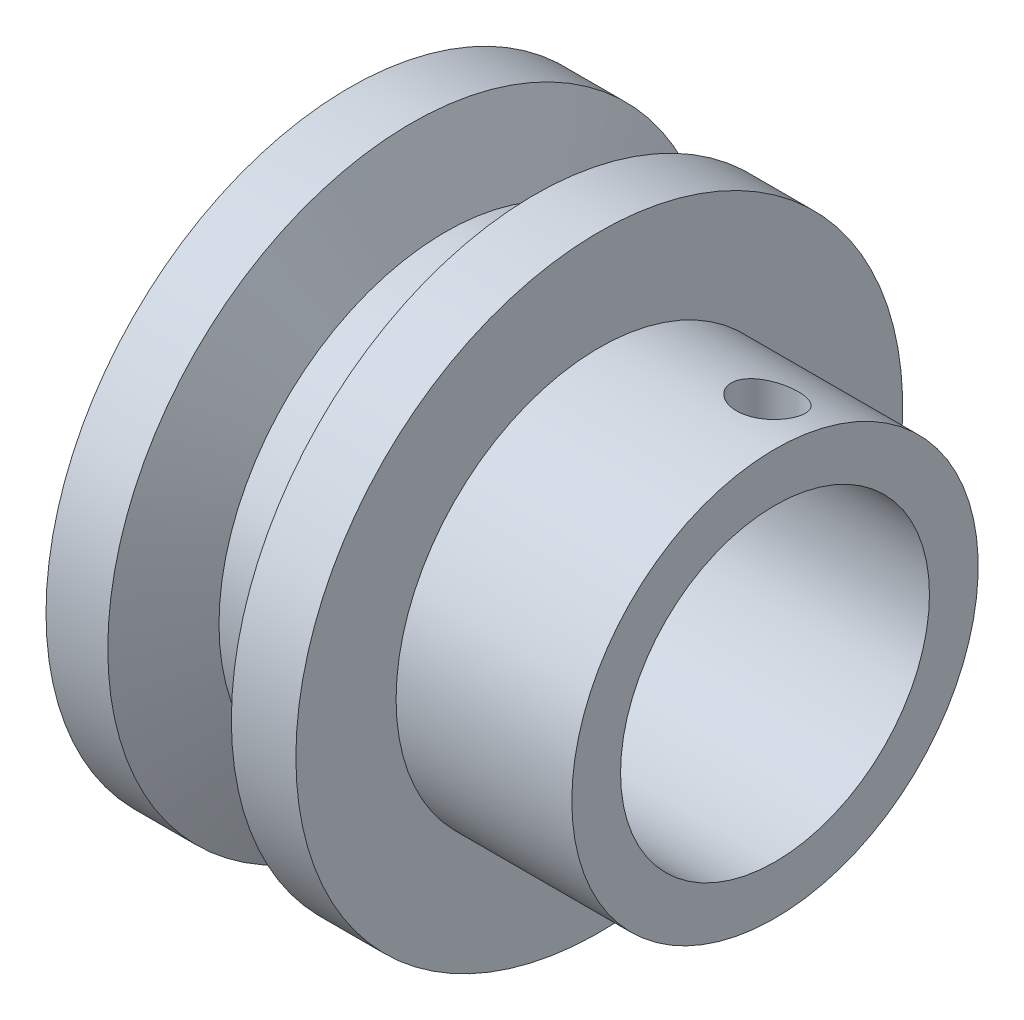
ISO-10303-21;
HEADER;
FILE_DESCRIPTION(('STEP AP214'),'2;1');
FILE_NAME('part.step','',(''),(''),'','','');
FILE_SCHEMA(('AUTOMOTIVE_DESIGN { 1 0 10303 214 1 1 1 1 }'));
ENDSEC;
DATA;
#1=APPLICATION_CONTEXT('core data for automotive mechanical design processes');
#2=APPLICATION_PROTOCOL_DEFINITION('international standard','automotive_design',2000,#1);
#3=PRODUCT_CONTEXT('',#1,'mechanical');
#4=PRODUCT('Part','Part','',(#3));
#5=PRODUCT_RELATED_PRODUCT_CATEGORY('part','',(#4));
#6=PRODUCT_DEFINITION_FORMATION('','',#4);
#7=PRODUCT_DEFINITION_CONTEXT('part definition',#1,'design');
#8=PRODUCT_DEFINITION('design','',#6,#7);
#9=PRODUCT_DEFINITION_SHAPE('','',#8);
#10=(LENGTH_UNIT() NAMED_UNIT(*) SI_UNIT(.MILLI.,.METRE.));
#11=(NAMED_UNIT(*) PLANE_ANGLE_UNIT() SI_UNIT($,.RADIAN.));
#12=(NAMED_UNIT(*) SI_UNIT($,.STERADIAN.) SOLID_ANGLE_UNIT());
#13=UNCERTAINTY_MEASURE_WITH_UNIT(LENGTH_MEASURE(1.E-05),#10,'distance_accuracy_value','');
#14=(GEOMETRIC_REPRESENTATION_CONTEXT(3) GLOBAL_UNCERTAINTY_ASSIGNED_CONTEXT((#13)) GLOBAL_UNIT_ASSIGNED_CONTEXT((#10,
#11,#12)) REPRESENTATION_CONTEXT('',''));
#15=CARTESIAN_POINT('',(0.,0.,0.));
#16=DIRECTION('',(0.,0.,1.));
#17=DIRECTION('',(1.,0.,0.));
#18=AXIS2_PLACEMENT_3D('',#15,#16,#17);
#19=CARTESIAN_POINT('',(-184.465974625144,0.,0.));
#20=DIRECTION('',(-1.,0.,0.));
#21=DIRECTION('',(0.,0.,1.));
#22=AXIS2_PLACEMENT_3D('',#19,#20,#21);
#23=CYLINDRICAL_SURFACE('',#22,98.6666666666667);
#24=CARTESIAN_POINT('',(-21.1326412918108,0.,0.));
#25=DIRECTION('',(-1.,0.,0.));
#26=DIRECTION('',(0.,0.,1.));
#27=AXIS2_PLACEMENT_3D('',#24,#25,#26);
#28=CIRCLE('',#27,98.6666666666667);
#29=CARTESIAN_POINT('',(-21.1326412918108,0.,98.6666666666667));
#30=VERTEX_POINT('',#29);
#31=EDGE_CURVE('E45',#30,#30,#28,.T.);
#32=ORIENTED_EDGE('',*,*,#31,.F.);
#33=EDGE_LOOP('',(#32));
#34=FACE_BOUND('',#33,.T.);
#35=CARTESIAN_POINT('',(64.2006920415225,0.,0.));
#36=DIRECTION('',(-1.,0.,0.));
#37=DIRECTION('',(0.,0.,1.));
#38=AXIS2_PLACEMENT_3D('',#35,#36,#37);
#39=CIRCLE('',#38,98.6666666666667);
#40=CARTESIAN_POINT('',(64.2006920415225,0.,98.6666666666667));
#41=VERTEX_POINT('',#40);
#42=EDGE_CURVE('E10',#41,#41,#39,.T.);
#43=ORIENTED_EDGE('',*,*,#42,.T.);
#44=EDGE_LOOP('',(#43));
#45=FACE_BOUND('',#44,.T.);
#46=CARTESIAN_POINT('',(38.62859353601,91.5009759491134,-36.9145298151133));
#47=CARTESIAN_POINT('',(39.0301218712129,91.5009717427589,-36.914536509223));
#48=CARTESIAN_POINT('',(39.4315711174031,91.5074884571739,-36.8983983967925));
#49=CARTESIAN_POINT('',(40.2315953728487,91.5334193797865,-36.8340266462339));
#50=CARTESIAN_POINT('',(40.6301697301343,91.5528364259943,-36.7857859456889));
#51=CARTESIAN_POINT('',(41.4217320003318,91.6042207188047,-36.6576403254521));
#52=CARTESIAN_POINT('',(41.8147144569709,91.6361994543381,-36.5777064185008));
#53=CARTESIAN_POINT('',(42.5919145446302,91.7120951866746,-36.3869925576597));
#54=CARTESIAN_POINT('',(42.9761326142882,91.7560115845974,-36.2762141511482));
#55=CARTESIAN_POINT('',(43.732318651247,91.8548634340976,-36.0251760119978));
#56=CARTESIAN_POINT('',(44.1043133644395,91.9097726623649,-35.8849864021136));
#57=CARTESIAN_POINT('',(44.8346331980816,92.0297226651269,-35.5762373707614));
#58=CARTESIAN_POINT('',(45.1929581918263,92.0947635335036,-35.4076776864089));
#59=CARTESIAN_POINT('',(45.8937622518524,92.2339046498616,-35.0436284065512));
#60=CARTESIAN_POINT('',(46.2362427528163,92.3080040753894,-34.8481412556671));
#61=CARTESIAN_POINT('',(46.9034978615478,92.4641313526456,-34.4317433705628));
#62=CARTESIAN_POINT('',(47.2282711493652,92.5461597941668,-34.2108307448576));
#63=CARTESIAN_POINT('',(47.8702470260019,92.7201774212888,-33.7364195654567));
#64=CARTESIAN_POINT('',(48.1867043138592,92.8124253388273,-33.4820073546321));
#65=CARTESIAN_POINT('',(48.7969830216495,93.0028466662035,-32.9493793096656));
#66=CARTESIAN_POINT('',(49.0908039998588,93.1010201916065,-32.6711630112355));
#67=CARTESIAN_POINT('',(49.6543485757748,93.3019903223622,-32.0927321455316));
#68=CARTESIAN_POINT('',(49.9240666133247,93.4047879862486,-31.7925125313737));
#69=CARTESIAN_POINT('',(50.4379575170997,93.613691022678,-31.1720247387181));
#70=CARTESIAN_POINT('',(50.682129304208,93.7197965347046,-30.8517557142121));
#71=CARTESIAN_POINT('',(51.1579228558754,93.9406804550035,-30.1727497936014));
#72=CARTESIAN_POINT('',(51.3878387335688,94.0555898400493,-29.8128587092028));
#73=CARTESIAN_POINT('',(51.8160719897504,94.2862911688456,-29.0750033888213));
#74=CARTESIAN_POINT('',(52.0143881089356,94.4020831475764,-28.6970384333443));
#75=CARTESIAN_POINT('',(52.3781896438354,94.6332145385122,-27.9254012278552));
#76=CARTESIAN_POINT('',(52.5436692889637,94.7485538676852,-27.5317262315811));
#77=CARTESIAN_POINT('',(52.8406050476849,94.9774908747985,-26.731266597979));
#78=CARTESIAN_POINT('',(52.9720618945097,95.0910885902231,-26.3244822433858));
#79=CARTESIAN_POINT('',(53.2025554518576,95.3179563314827,-25.4909609261016));
#80=CARTESIAN_POINT('',(53.3007788205841,95.431158995847,-25.0639803033592));
#81=CARTESIAN_POINT('',(53.4596267128504,95.65339737502,-24.2019994493382));
#82=CARTESIAN_POINT('',(53.5202504430367,95.7624330018586,-23.7669990490414));
#83=CARTESIAN_POINT('',(53.603149688488,95.9753298806492,-22.8921343469774));
#84=CARTESIAN_POINT('',(53.6254284288382,96.0791915670528,-22.4522704573963));
#85=CARTESIAN_POINT('',(53.6311305711296,96.2808973089582,-21.5709126630746));
#86=CARTESIAN_POINT('',(53.6145549828887,96.3787415207854,-21.1294188009945));
#87=CARTESIAN_POINT('',(53.5430496908729,96.5657723111823,-20.2572833153441));
#88=CARTESIAN_POINT('',(53.4889178761471,96.6550958058904,-19.8266056310573));
#89=CARTESIAN_POINT('',(53.3432025108384,96.8268162837145,-18.9702259224994));
#90=CARTESIAN_POINT('',(53.2516193075208,96.9092133310469,-18.5445238521299));
#91=CARTESIAN_POINT('',(53.0313790276549,97.0667374396666,-17.7015099610296));
#92=CARTESIAN_POINT('',(52.9027274773841,97.1418655823989,-17.2841968995498));
#93=CARTESIAN_POINT('',(52.6090365673766,97.2846964775636,-16.4612681289381));
#94=CARTESIAN_POINT('',(52.443998105747,97.3523994132042,-16.0556521313769));
#95=CARTESIAN_POINT('',(52.0845291303946,97.4782842800926,-15.2724391873188));
#96=CARTESIAN_POINT('',(51.8912321631204,97.536704640204,-14.8943598934186));
#97=CARTESIAN_POINT('',(51.472790599409,97.6467131149507,-14.1552163145361));
#98=CARTESIAN_POINT('',(51.2476466993244,97.6983013789263,-13.7941516577485));
#99=CARTESIAN_POINT('',(50.7670519291384,97.7948822202628,-13.0918969786943));
#100=CARTESIAN_POINT('',(50.5116034572429,97.8398753189147,-12.7507053869195));
#101=CARTESIAN_POINT('',(49.9721778127899,97.9236084475594,-12.0908498796233));
#102=CARTESIAN_POINT('',(49.6882008329898,97.9623485197972,-11.7721858119158));
#103=CARTESIAN_POINT('',(49.0990527954549,98.033351686628,-11.16533746096));
#104=CARTESIAN_POINT('',(48.7943484685092,98.065717715724,-10.8767119082655));
#105=CARTESIAN_POINT('',(48.1615371741578,98.1252568663559,-10.3257864581963));
#106=CARTESIAN_POINT('',(47.8334305256932,98.1524300586445,-10.0634862021616));
#107=CARTESIAN_POINT('',(47.1561471736201,98.202049015031,-9.56717838539647));
#108=CARTESIAN_POINT('',(46.8069707752029,98.2244948475826,-9.33317041500517));
#109=CARTESIAN_POINT('',(46.0900311656197,98.265127267985,-8.8951823720583));
#110=CARTESIAN_POINT('',(45.7222679101382,98.2833138456802,-8.69120237110109));
#111=CARTESIAN_POINT('',(44.9717258246609,98.3158341733122,-8.31525060331513));
#112=CARTESIAN_POINT('',(44.5889870381652,98.3301774876261,-8.14319971207769));
#113=CARTESIAN_POINT('',(43.8103474923087,98.355475428758,-7.83173006252303));
#114=CARTESIAN_POINT('',(43.4144467699804,98.3664300651095,-7.69231121240084));
#115=CARTESIAN_POINT('',(42.6122874601177,98.3852972621576,-7.44711540096298));
#116=CARTESIAN_POINT('',(42.2060287903621,98.3932097986979,-7.34133870678853));
#117=CARTESIAN_POINT('',(41.3860339542456,98.4062668881017,-7.16419197119803));
#118=CARTESIAN_POINT('',(40.9722977714588,98.4114114348838,-7.09282200537381));
#119=CARTESIAN_POINT('',(40.1394691331727,98.4191305207232,-6.984897907563));
#120=CARTESIAN_POINT('',(39.7203678486881,98.4217000580872,-6.9484115396987));
#121=CARTESIAN_POINT('',(38.8805736423554,98.4243511333911,-6.9107577994148));
#122=CARTESIAN_POINT('',(38.459880718682,98.424432668477,-6.90959046750936));
#123=CARTESIAN_POINT('',(37.6198860599346,98.4221109238494,-6.94258337628694));
#124=CARTESIAN_POINT('',(37.2005843351928,98.419707625723,-6.97674387875586));
#125=CARTESIAN_POINT('',(36.3663519410056,98.4123229771473,-7.08014671621338));
#126=CARTESIAN_POINT('',(35.951421272279,98.4073416262741,-7.14938905697185));
#127=CARTESIAN_POINT('',(35.1285584124505,98.3946101007406,-7.32252307898679));
#128=CARTESIAN_POINT('',(34.7206319149335,98.3868577758108,-7.42644166475737));
#129=CARTESIAN_POINT('',(33.9150142039841,98.3683134966489,-7.66816074780152));
#130=CARTESIAN_POINT('',(33.5173229976883,98.3575215402974,-7.80596126869881));
#131=CARTESIAN_POINT('',(32.7350146241934,98.3325527182556,-8.11443861979521));
#132=CARTESIAN_POINT('',(32.3503973732729,98.3183758742457,-8.2851152394197));
#133=CARTESIAN_POINT('',(31.596980337213,98.2862327185873,-8.65809356254367));
#134=CARTESIAN_POINT('',(31.2281805301998,98.2682664121795,-8.86039522230742));
#135=CARTESIAN_POINT('',(30.5094138531133,98.2281196748715,-9.2948987515775));
#136=CARTESIAN_POINT('',(30.1594273960197,98.2059437401978,-9.52706863488025));
#137=CARTESIAN_POINT('',(29.4803571926571,98.1568996054851,-10.019752018269));
#138=CARTESIAN_POINT('',(29.1512734240359,98.1300314104639,-10.280265488045));
#139=CARTESIAN_POINT('',(28.5163518613366,98.0711386164858,-10.8276790945583));
#140=CARTESIAN_POINT('',(28.2105133192139,98.0391141835631,-11.1145783815278));
#141=CARTESIAN_POINT('',(27.6242217570781,97.9694669184756,-11.7126110821938));
#142=CARTESIAN_POINT('',(27.343768695147,97.9318440955554,-12.023744455872));
#143=CARTESIAN_POINT('',(26.8106890788482,97.8506809752044,-12.6672928213209));
#144=CARTESIAN_POINT('',(26.5580117301649,97.8071518160798,-12.9996671467967));
#145=CARTESIAN_POINT('',(26.0815916341042,97.7137986047832,-13.6837057840911));
#146=CARTESIAN_POINT('',(25.8578488074824,97.663974569852,-14.0353700430758));
#147=CARTESIAN_POINT('',(25.4407600606907,97.5577966457643,-14.7553313775962));
#148=CARTESIAN_POINT('',(25.2474134821962,97.5014428980747,-15.1236280926824));
#149=CARTESIAN_POINT('',(24.8923059822969,97.38207362227,-15.8741046164978));
#150=CARTESIAN_POINT('',(24.7305451928043,97.3190580663348,-16.2562844831995));
#151=CARTESIAN_POINT('',(24.4389424535877,97.1860830749275,-17.0332711831853));
#152=CARTESIAN_POINT('',(24.3092326065329,97.1160965158794,-17.4281229380483));
#153=CARTESIAN_POINT('',(24.0832425752705,96.9695103819737,-18.2260723205306));
#154=CARTESIAN_POINT('',(23.9869624018989,96.8929108049726,-18.6291699508226));
#155=CARTESIAN_POINT('',(23.8282094016543,96.7333424531631,-19.4407459107231));
#156=CARTESIAN_POINT('',(23.7657386269929,96.6503732920734,-19.8492245654155));
#157=CARTESIAN_POINT('',(23.6747361613829,96.4784512890299,-20.6686919699409));
#158=CARTESIAN_POINT('',(23.6462049864826,96.3894983561152,-21.0796807578449));
#159=CARTESIAN_POINT('',(23.6227387654251,96.2043005878997,-21.9095402389591));
#160=CARTESIAN_POINT('',(23.6284811259628,96.1079461356206,-22.3284056234565));
#161=CARTESIAN_POINT('',(23.6747983732042,95.9102189484909,-23.1630080957911));
#162=CARTESIAN_POINT('',(23.7153736440579,95.8088461583078,-23.5787451490769));
#163=CARTESIAN_POINT('',(23.8308147845361,95.6018658936547,-24.4044160245784));
#164=CARTESIAN_POINT('',(23.9056851851532,95.4962578613171,-24.8143490726027));
#165=CARTESIAN_POINT('',(24.0890005621213,95.2817270442488,-25.6257631380143));
#166=CARTESIAN_POINT('',(24.1974470318925,95.1728041122701,-26.0272437786009));
#167=CARTESIAN_POINT('',(24.4511255230596,94.9490689955606,-26.832173445676));
#168=CARTESIAN_POINT('',(24.597441498311,94.8341805800209,-27.2352599660626));
#169=CARTESIAN_POINT('',(24.9238731688014,94.6031733377179,-28.0271448412869));
#170=CARTESIAN_POINT('',(25.1039896320595,94.4870544830529,-28.4159428712195));
#171=CARTESIAN_POINT('',(25.4968055441388,94.2549112817479,-29.1767198884418));
#172=CARTESIAN_POINT('',(25.7095033446072,94.1388869306251,-29.5486997253639));
#173=CARTESIAN_POINT('',(26.1662642360343,93.9082815901503,-30.2735942444561));
#174=CARTESIAN_POINT('',(26.410341013583,93.7937012547239,-30.6265005113203));
#175=CARTESIAN_POINT('',(26.9333172342843,93.565345035707,-31.3172825972921));
#176=CARTESIAN_POINT('',(27.2127950797028,93.4516267922363,-31.6547399794782));
#177=CARTESIAN_POINT('',(27.800936708526,93.2289711631732,-32.3046126709089));
#178=CARTESIAN_POINT('',(28.1095874459884,93.120031672164,-32.6170390594517));
#179=CARTESIAN_POINT('',(28.7544415149252,92.9085225499397,-33.21472727458));
#180=CARTESIAN_POINT('',(29.0906562215742,92.8059555795597,-33.4999777800872));
#181=CARTESIAN_POINT('',(29.7884048071624,92.6089599446147,-34.0407769211182));
#182=CARTESIAN_POINT('',(30.1499374112811,92.5145308708194,-34.2963270504106));
#183=CARTESIAN_POINT('',(30.8862510076313,92.3378354388367,-34.7692009390769));
#184=CARTESIAN_POINT('',(31.2604446156882,92.2553170171163,-34.9873446872247));
#185=CARTESIAN_POINT('',(32.0280547902506,92.1011400985122,-35.3912114521715));
#186=CARTESIAN_POINT('',(32.4214697556503,92.0294806991235,-35.5769371634637));
#187=CARTESIAN_POINT('',(33.224168663113,91.898521001807,-35.9138638858715));
#188=CARTESIAN_POINT('',(33.6334297919252,91.839203666582,-36.0651125179687));
#189=CARTESIAN_POINT('',(34.4649976155085,91.7340635043769,-36.3317107872563));
#190=CARTESIAN_POINT('',(34.8873000002131,91.6882362706266,-36.4470721483327));
#191=CARTESIAN_POINT('',(35.8562740084855,91.6007193805327,-36.6665659938922));
#192=CARTESIAN_POINT('',(36.4059490184555,91.5634289990225,-36.7594062027316));
#193=CARTESIAN_POINT('',(37.5133317067185,91.5135609933595,-36.8833814941012));
#194=CARTESIAN_POINT('',(38.071038869402,91.5009817899777,-36.914520519799));
#195=CARTESIAN_POINT('',(38.62859353601,91.5009759491134,-36.9145298151133));
#196=B_SPLINE_CURVE_WITH_KNOTS('',3,(#46,#47,#48,#49,#50,#51,#52,#53,#54,#55,#56,#57,#58,#59,
#60,#61,#62,#63,#64,#65,#66,#67,#68,#69,#70,#71,#72,#73,#74,#75,#76,#77,#78,#79,#80,#81,#82,#83,
#84,#85,#86,#87,#88,#89,#90,#91,#92,#93,#94,#95,#96,#97,#98,#99,#100,#101,#102,#103,#104,#105,
#106,#107,#108,#109,#110,#111,#112,#113,#114,#115,#116,#117,#118,#119,#120,#121,#122,#123,#124,
#125,#126,#127,#128,#129,#130,#131,#132,#133,#134,#135,#136,#137,#138,#139,#140,#141,#142,#143,
#144,#145,#146,#147,#148,#149,#150,#151,#152,#153,#154,#155,#156,#157,#158,#159,#160,#161,#162,
#163,#164,#165,#166,#167,#168,#169,#170,#171,#172,#173,#174,#175,#176,#177,#178,#179,#180,#181,
#182,#183,#184,#185,#186,#187,#188,#189,#190,#191,#192,#193,#194,#195),.UNSPECIFIED.,.T.,.F.,(4,
2,2,2,2,2,2,2,2,2,2,2,2,2,2,2,2,2,2,2,2,2,2,2,2,2,2,2,2,2,2,2,2,2,2,2,2,2,2,2,2,2,2,2,2,2,2,2,2,
2,2,2,2,2,2,2,2,2,2,2,2,2,2,2,2,2,2,2,2,2,2,2,2,2,4),(0.,1.20407304977522,2.40841107750791,
3.6138531679983,4.81923479588063,6.02177454199192,7.22432543175762,8.42676721932183,
9.62929851839672,10.8771010167653,12.1249278585186,13.3730418145558,14.6212084717655,
15.9464459328195,17.2717361935938,18.5972591511521,19.9227535397241,21.2786701277888,
22.6346153247656,23.9904464715731,25.346242380929,26.6740824904272,28.0019102879083,
29.3295402305583,30.6571374081214,31.9414559335857,33.2257463809817,34.5099352614971,
35.7941154657653,37.0554577386359,38.3167828244381,39.5780896445702,40.8393994720999,
42.0975406097627,43.355678207806,44.6138257960534,45.8719761484473,47.132565620178,
48.3931565379193,49.6537567969436,50.9143572632972,52.1759380840706,53.4375197844669,
54.6990934045784,55.9606652800172,57.2208971990741,58.4811277704834,59.7413177697707,
61.0015056881257,62.2593493150404,63.5171894969688,64.7750024327302,66.0328206214017,
67.295739714666,68.558659217297,69.8216553698451,71.0846707258834,72.3727308100995,
73.6608050996969,74.9490496157773,76.2373514395465,77.5676517918964,78.897982375165,
80.2282456766535,81.559091181114,82.9154776014972,84.271260298303,85.6276053471834,
86.9838821496857,88.3049579962014,89.6259239863801,90.945054203261,92.2637530244902,
93.9358129927109,95.6077661003288),.UNSPECIFIED.);
#197=CARTESIAN_POINT('',(38.62859353601,91.5009759491134,-36.9145298151133));
#198=VERTEX_POINT('',#197);
#199=EDGE_CURVE('E73',#198,#198,#196,.T.);
#200=ORIENTED_EDGE('',*,*,#199,.T.);
#201=EDGE_LOOP('',(#200));
#202=FACE_BOUND('',#201,.T.);
#203=ADVANCED_FACE('F32',(#34,#45,#202),#23,.T.);
#204=CARTESIAN_POINT('',(64.2006920415225,0.,0.));
#205=DIRECTION('',(-1.,0.,0.));
#206=DIRECTION('',(0.,0.,1.));
#207=AXIS2_PLACEMENT_3D('',#204,#205,#206);
#208=CYLINDRICAL_SURFACE('',#207,75.);
#209=CARTESIAN_POINT('',(64.2006920415225,0.,0.));
#210=DIRECTION('',(-1.,0.,0.));
#211=DIRECTION('',(0.,0.,1.));
#212=AXIS2_PLACEMENT_3D('',#209,#210,#211);
#213=CIRCLE('',#212,75.);
#214=CARTESIAN_POINT('',(64.2006920415225,0.,75.));
#215=VERTEX_POINT('',#214);
#216=EDGE_CURVE('E69',#215,#215,#213,.T.);
#217=ORIENTED_EDGE('',*,*,#216,.F.);
#218=EDGE_LOOP('',(#217));
#219=FACE_BOUND('',#218,.T.);
#220=CARTESIAN_POINT('',(-142.465974625144,0.,0.));
#221=DIRECTION('',(-1.,0.,0.));
#222=DIRECTION('',(0.,0.,1.));
#223=AXIS2_PLACEMENT_3D('',#220,#221,#222);
#224=CIRCLE('',#223,75.);
#225=CARTESIAN_POINT('',(-142.465974625144,0.,75.));
#226=VERTEX_POINT('',#225);
#227=EDGE_CURVE('E70',#226,#226,#224,.T.);
#228=ORIENTED_EDGE('',*,*,#227,.T.);
#229=EDGE_LOOP('',(#228));
#230=FACE_BOUND('',#229,.T.);
#231=CARTESIAN_POINT('',(38.62859353601,65.2864265259565,-36.9145298151133));
#232=CARTESIAN_POINT('',(39.0148585433329,65.2864288943747,-36.9145269370592));
#233=CARTESIAN_POINT('',(39.4011790048403,65.2948811350695,-36.899589457055));
#234=CARTESIAN_POINT('',(40.1708285215854,65.328502989368,-36.8400302864068));
#235=CARTESIAN_POINT('',(40.554156994653,65.3536757782042,-36.7954029576569));
#236=CARTESIAN_POINT('',(41.3151864931924,65.4201957862907,-36.6770035363477));
#237=CARTESIAN_POINT('',(41.6928825486215,65.4615565035683,-36.6032071211337));
#238=CARTESIAN_POINT('',(42.4395900474296,65.5595495851603,-36.4274012516175));
#239=CARTESIAN_POINT('',(42.808601810357,65.6161813865996,-36.3253928371743));
#240=CARTESIAN_POINT('',(43.5341316705288,65.7433093070616,-36.094799134019));
#241=CARTESIAN_POINT('',(43.8906925766169,65.8137509452514,-35.9663181830168));
#242=CARTESIAN_POINT('',(44.590736219219,65.9673077587859,-35.6838916341733));
#243=CARTESIAN_POINT('',(44.9342188797003,66.0504230077968,-35.5299458883154));
#244=CARTESIAN_POINT('',(45.6062861807847,66.2278774791112,-35.1980628518491));
#245=CARTESIAN_POINT('',(45.9348728585485,66.3222151602111,-35.0201288551582));
#246=CARTESIAN_POINT('',(46.5758239037639,66.5206759154981,-34.64167050899));
#247=CARTESIAN_POINT('',(46.8881819525381,66.6248027574522,-34.4411374553721));
#248=CARTESIAN_POINT('',(47.5148618901315,66.8483102070097,-34.0053989553419));
#249=CARTESIAN_POINT('',(47.8280127151248,66.9682414051077,-33.7687918111314));
#250=CARTESIAN_POINT('',(48.4331600981641,67.2157641491241,-33.2733788982831));
#251=CARTESIAN_POINT('',(48.7251493919245,67.3433582983354,-33.0145655727135));
#252=CARTESIAN_POINT('',(49.2867988566727,67.6045139705783,-32.4764396882459));
#253=CARTESIAN_POINT('',(49.5564551448008,67.7380765250997,-32.1971235805515));
#254=CARTESIAN_POINT('',(50.0723911333394,68.0095529701848,-31.6196538875624));
#255=CARTESIAN_POINT('',(50.3186696970341,68.1474670719035,-31.3214993874447));
#256=CARTESIAN_POINT('',(50.8136125971576,68.4420216700631,-30.6729602560472));
#257=CARTESIAN_POINT('',(51.059352194726,68.5990055704947,-30.3204950588675));
#258=CARTESIAN_POINT('',(51.5193873938464,68.9144981843035,-29.5964164527096));
#259=CARTESIAN_POINT('',(51.733690736447,69.073006512018,-29.2248077882882));
#260=CARTESIAN_POINT('',(52.1298860464847,69.3898788515299,-28.46426723346));
#261=CARTESIAN_POINT('',(52.3117559853271,69.5482426931097,-28.0753237917862));
#262=CARTESIAN_POINT('',(52.6416731747023,69.8629607088389,-27.2827502899837));
#263=CARTESIAN_POINT('',(52.7897325671151,70.0193155853416,-26.8791255626838));
#264=CARTESIAN_POINT('',(53.0569957586249,70.3356375049153,-26.0405073290426));
#265=CARTESIAN_POINT('',(53.174554792392,70.4954388161842,-25.6049254907574));
#266=CARTESIAN_POINT('',(53.3702484273552,70.8095424297355,-24.7230217661101));
#267=CARTESIAN_POINT('',(53.4483814216532,70.9638445076459,-24.2766994427716));
#268=CARTESIAN_POINT('',(53.5640677058342,71.2654366267072,-23.37654376287));
#269=CARTESIAN_POINT('',(53.6016269375128,71.4127276915601,-22.9227115159784));
#270=CARTESIAN_POINT('',(53.6352190171768,71.6990111947732,-22.0109083352385));
#271=CARTESIAN_POINT('',(53.631253873164,71.8380040340853,-21.5529376025858));
#272=CARTESIAN_POINT('',(53.5819548220881,72.1019967366744,-20.6522332050047));
#273=CARTESIAN_POINT('',(53.5380413904618,72.2273126985879,-20.2095144899134));
#274=CARTESIAN_POINT('',(53.4104866034622,72.4683978268633,-19.3271944719558));
#275=CARTESIAN_POINT('',(53.3268458086765,72.5841671279099,-18.8875931251895));
#276=CARTESIAN_POINT('',(53.1198783551331,72.8055570891468,-18.0153619366183));
#277=CARTESIAN_POINT('',(52.9965633743316,72.911180723813,-17.5827300826676));
#278=CARTESIAN_POINT('',(52.710655435092,73.1119795481375,-16.7281525086504));
#279=CARTESIAN_POINT('',(52.5480644488258,73.20715526207,-16.3062062532015));
#280=CARTESIAN_POINT('',(52.1951582978707,73.3816754241088,-15.5012666237302));
#281=CARTESIAN_POINT('',(52.0070345617685,73.461621596999,-15.1174414689433));
#282=CARTESIAN_POINT('',(51.597829168999,73.6122822844147,-14.3658893653039));
#283=CARTESIAN_POINT('',(51.3767488347027,73.6829971691288,-13.9981617713086));
#284=CARTESIAN_POINT('',(50.9030818223969,73.8154600987054,-13.2819610950002));
#285=CARTESIAN_POINT('',(50.6504997491992,73.8772094512682,-12.9334852092621));
#286=CARTESIAN_POINT('',(50.1155493248544,73.9921728962735,-12.2586914366871));
#287=CARTESIAN_POINT('',(49.8331813833556,74.0453871060755,-11.9323732452144));
#288=CARTESIAN_POINT('',(49.2504881386141,74.1421922392579,-11.3150230568675));
#289=CARTESIAN_POINT('',(48.9510620842278,74.1860426400198,-11.023182292962));
#290=CARTESIAN_POINT('',(48.3283680188191,74.2668225966756,-10.4651122651615));
#291=CARTESIAN_POINT('',(48.0051006169579,74.3037523293115,-10.1988823472935));
#292=CARTESIAN_POINT('',(47.3370226022759,74.3712915156644,-9.6941148550588));
#293=CARTESIAN_POINT('',(46.9922126525539,74.4019011637943,-9.4555764289687));
#294=CARTESIAN_POINT('',(46.2835020960628,74.4574137667948,-9.00801906053877));
#295=CARTESIAN_POINT('',(45.919601411892,74.4823166985258,-8.7990002378963));
#296=CARTESIAN_POINT('',(45.1772434246565,74.5268926792515,-8.41307463423762));
#297=CARTESIAN_POINT('',(44.798870976181,74.5465920658757,-8.2360076330559));
#298=CARTESIAN_POINT('',(44.0285016730466,74.5814662281855,-7.91398399066117));
#299=CARTESIAN_POINT('',(43.6365048940708,74.5966410290006,-7.76902717110962));
#300=CARTESIAN_POINT('',(42.8416562855726,74.6229333080118,-7.51228935205863));
#301=CARTESIAN_POINT('',(42.4388043110656,74.6340507319877,-7.40050879590938));
#302=CARTESIAN_POINT('',(41.6250960908697,74.6526047314725,-7.21094221135895));
#303=CARTESIAN_POINT('',(41.2142398133987,74.6600412923628,-7.13315631796722));
#304=CARTESIAN_POINT('',(40.3860455719875,74.6715232376431,-7.0119430143594));
#305=CARTESIAN_POINT('',(39.9686905927995,74.6755572587282,-6.96863076108376));
#306=CARTESIAN_POINT('',(39.1318005186681,74.6803470448454,-6.91711191496827));
#307=CARTESIAN_POINT('',(38.7122654195859,74.6811028036516,-6.90890538879955));
#308=CARTESIAN_POINT('',(37.8739827932561,74.6793655884863,-6.92765782903642));
#309=CARTESIAN_POINT('',(37.4552352766187,74.6768725710579,-6.95461726583526));
#310=CARTESIAN_POINT('',(36.6215018101057,74.668540926009,-7.04350644392393));
#311=CARTESIAN_POINT('',(36.2065158618522,74.6627022969459,-7.10543620029211));
#312=CARTESIAN_POINT('',(35.3826325479867,74.6474487912764,-7.26393337529682));
#313=CARTESIAN_POINT('',(34.9737452401783,74.6380285677009,-7.36055256979291));
#314=CARTESIAN_POINT('',(34.1656116033988,74.61527843029,-7.5877031868886));
#315=CARTESIAN_POINT('',(33.7663652871471,74.6019485112971,-7.71823465422555));
#316=CARTESIAN_POINT('',(32.9803699553544,74.5709448875703,-8.01224134017692));
#317=CARTESIAN_POINT('',(32.5936208256774,74.5532712225205,-8.17571625782215));
#318=CARTESIAN_POINT('',(31.8353852044599,74.5130644626112,-8.53438743459798));
#319=CARTESIAN_POINT('',(31.4638986782427,74.4905313787933,-8.72958362165271));
#320=CARTESIAN_POINT('',(30.7394589519265,74.4400741188659,-9.14986677000813));
#321=CARTESIAN_POINT('',(30.3864756595324,74.4121590649041,-9.37490295542014));
#322=CARTESIAN_POINT('',(29.7008900741847,74.3503105648167,-9.85339987322077));
#323=CARTESIAN_POINT('',(29.3682877474861,74.3163771286561,-10.1068605585446));
#324=CARTESIAN_POINT('',(28.7258400855796,74.2418879105413,-10.6402329378161));
#325=CARTESIAN_POINT('',(28.4159935261158,74.2013324852278,-10.9201432069255));
#326=CARTESIAN_POINT('',(27.821209219502,74.1130199154321,-11.5042379880193));
#327=CARTESIAN_POINT('',(27.5362713972354,74.0652627926691,-11.8084224267954));
#328=CARTESIAN_POINT('',(26.9941606991491,73.9621991413297,-12.4376187899027));
#329=CARTESIAN_POINT('',(26.7368986240468,73.9069182519401,-12.7625580725122));
#330=CARTESIAN_POINT('',(26.2507468109669,73.7882593350809,-13.4316114608174));
#331=CARTESIAN_POINT('',(26.021856944297,73.7248813443412,-13.775725479529));
#332=CARTESIAN_POINT('',(25.5938756928784,73.5897158016968,-14.4804148842947));
#333=CARTESIAN_POINT('',(25.3947832110828,73.517928559568,-14.8409896636766));
#334=CARTESIAN_POINT('',(25.0275156234343,73.3657615660749,-15.575807917185));
#335=CARTESIAN_POINT('',(24.859340704978,73.2853817626341,-15.9500514741439));
#336=CARTESIAN_POINT('',(24.5538501511483,73.1155031001262,-16.7115608000284));
#337=CARTESIAN_POINT('',(24.4167203687302,73.0259537523389,-17.0988898282566));
#338=CARTESIAN_POINT('',(24.1751209724858,72.8382583145386,-17.881556682751));
#339=CARTESIAN_POINT('',(24.0706513696845,72.7401122216237,-18.2768945117208));
#340=CARTESIAN_POINT('',(23.8946080033997,72.5355048925783,-19.0727383130947));
#341=CARTESIAN_POINT('',(23.8230372129867,72.429042905956,-19.4732447492256));
#342=CARTESIAN_POINT('',(23.7127763524161,72.2082603054363,-20.2766045553497));
#343=CARTESIAN_POINT('',(23.6740870364717,72.0939395113438,-20.6794579789631));
#344=CARTESIAN_POINT('',(23.6286095995607,71.8542619899662,-21.4977332917798));
#345=CARTESIAN_POINT('',(23.6228817207787,71.7286692004607,-21.9131449321866));
#346=CARTESIAN_POINT('',(23.6456496691855,71.4705629201028,-22.7408573529595));
#347=CARTESIAN_POINT('',(23.6741460925922,71.3380493087219,-23.1531580790047));
#348=CARTESIAN_POINT('',(23.7646774526376,71.0670283961364,-23.9721413246439));
#349=CARTESIAN_POINT('',(23.8267185464602,70.9285199988732,-24.3788227987554));
#350=CARTESIAN_POINT('',(23.9835215376862,70.6466034948436,-25.1841110101312));
#351=CARTESIAN_POINT('',(24.078285599226,70.5031950645785,-25.5827172114904));
#352=CARTESIAN_POINT('',(24.3058943332456,70.2044467344501,-26.3918929339954));
#353=CARTESIAN_POINT('',(24.4405908053856,70.048890933976,-26.8018625965946));
#354=CARTESIAN_POINT('',(24.7443651510724,69.7351750886898,-27.6078321845187));
#355=CARTESIAN_POINT('',(24.9134442997758,69.57701494749,-28.0038315910866));
#356=CARTESIAN_POINT('',(25.2848386013484,69.2597312917411,-28.7795981549221));
#357=CARTESIAN_POINT('',(25.487158221482,69.1006076504773,-29.1593631217488));
#358=CARTESIAN_POINT('',(25.9239218311937,68.7831376880434,-29.9005452042744));
#359=CARTESIAN_POINT('',(26.1583801789578,68.6247917472532,-30.2619540197765));
#360=CARTESIAN_POINT('',(26.6686604957429,68.3042635546594,-30.9788336436178));
#361=CARTESIAN_POINT('',(26.9458066592141,68.1421997215745,-31.3334166810505));
#362=CARTESIAN_POINT('',(27.5320207907504,67.823488081122,-32.0174455098152));
#363=CARTESIAN_POINT('',(27.8410745394654,67.6668379023917,-32.3469023855728));
#364=CARTESIAN_POINT('',(28.4899125509512,67.3612611780726,-32.9785326204136));
#365=CARTESIAN_POINT('',(28.8297132845491,67.2123388402186,-33.2806911808159));
#366=CARTESIAN_POINT('',(29.3608375171789,66.9968878488039,-33.7111674767076));
#367=CARTESIAN_POINT('',(29.5414486135417,66.9263932284538,-33.8508654234884));
#368=CARTESIAN_POINT('',(29.90967334556,66.7883453966705,-34.1224284088175));
#369=CARTESIAN_POINT('',(30.097289721493,66.720793359165,-34.2542903287287));
#370=CARTESIAN_POINT('',(30.6568607108552,66.527706434896,-34.6286187357529));
#371=CARTESIAN_POINT('',(31.0379788188718,66.4066739389636,-34.8598987357872));
#372=CARTESIAN_POINT('',(31.8226879841126,66.1795820814801,-35.2891191797777));
#373=CARTESIAN_POINT('',(32.2262755340934,66.0735203922298,-35.487064807573));
#374=CARTESIAN_POINT('',(33.052421331563,65.8790314262042,-35.8468266371766));
#375=CARTESIAN_POINT('',(33.4749425116381,65.7905713917359,-36.0087100213431));
#376=CARTESIAN_POINT('',(34.3361363266239,65.6334049857314,-36.2943911096278));
#377=CARTESIAN_POINT('',(34.7748019550222,65.5646901564198,-36.4182051221975));
#378=CARTESIAN_POINT('',(35.4971384679686,65.4706937417931,-36.5867965106574));
#379=CARTESIAN_POINT('',(35.7771668851478,65.4387913614262,-36.6437950538279));
#380=CARTESIAN_POINT('',(36.3408517226669,65.3838138648727,-36.7418027280481));
#381=CARTESIAN_POINT('',(36.6245076095648,65.3607374658523,-36.782814182797));
#382=CARTESIAN_POINT('',(37.1943018570204,65.3236981320184,-36.8485534023982));
#383=CARTESIAN_POINT('',(37.4804403031732,65.3097355127106,-36.8732806035138));
#384=CARTESIAN_POINT('',(38.0539069141217,65.2910995778604,-36.9062685524376));
#385=CARTESIAN_POINT('',(38.3412348795263,65.2864247639913,-36.9145319562179));
#386=CARTESIAN_POINT('',(38.62859353601,65.2864265259565,-36.9145298151133));
#387=B_SPLINE_CURVE_WITH_KNOTS('',3,(#231,#232,#233,#234,#235,#236,#237,#238,#239,#240,#241,
#242,#243,#244,#245,#246,#247,#248,#249,#250,#251,#252,#253,#254,#255,#256,#257,#258,#259,#260,
#261,#262,#263,#264,#265,#266,#267,#268,#269,#270,#271,#272,#273,#274,#275,#276,#277,#278,#279,
#280,#281,#282,#283,#284,#285,#286,#287,#288,#289,#290,#291,#292,#293,#294,#295,#296,#297,#298,
#299,#300,#301,#302,#303,#304,#305,#306,#307,#308,#309,#310,#311,#312,#313,#314,#315,#316,#317,
#318,#319,#320,#321,#322,#323,#324,#325,#326,#327,#328,#329,#330,#331,#332,#333,#334,#335,#336,
#337,#338,#339,#340,#341,#342,#343,#344,#345,#346,#347,#348,#349,#350,#351,#352,#353,#354,#355,
#356,#357,#358,#359,#360,#361,#362,#363,#364,#365,#366,#367,#368,#369,#370,#371,#372,#373,#374,
#375,#376,#377,#378,#379,#380,#381,#382,#383,#384,#385,#386),.UNSPECIFIED.,.T.,.F.,(4,2,2,2,2,2,
2,2,2,2,2,2,2,2,2,2,2,2,2,2,2,2,2,2,2,2,2,2,2,2,2,2,2,2,2,2,2,2,2,2,2,2,2,2,2,2,2,2,2,2,2,2,2,2,
2,2,2,2,2,2,2,2,2,2,2,2,2,2,2,2,2,2,2,2,2,2,2,4),(0.,1.15851272102105,2.31724550656841,
3.47694654716901,4.63660484833402,5.79177707551099,6.9469560174724,8.10197649869893,
9.25744337215883,10.487384902707,11.7177466645347,12.9483218923392,14.1789569248772,
15.549794613824,16.9202941709167,18.2917210479418,19.6626546475434,21.09678393769,
22.5309716743211,23.9649493538717,25.3988576906172,26.7836910328746,28.1685048345069,
29.5529113934479,30.9372484514194,32.2402131382911,33.5431255582692,34.8458477458943,
36.1485520193744,37.4082970590747,38.6680099226451,39.9276840302202,41.1873632454294,
42.4405388453817,43.6937074850778,44.9468928707096,46.2000832333098,47.4574424306128,
48.7148040158315,49.9721824201679,51.2295613666555,52.4888248745491,53.7480900436817,
55.007343708772,56.2665945126736,57.5237294262145,58.7808622582458,60.0379274071468,
61.2949887650205,62.5478688874664,63.8007433268183,65.0535716278846,66.3064075223119,
67.5665561246101,68.8267051522871,70.0869680374353,71.3472598288738,72.6478731153715,
73.9485090600442,75.2493838198473,76.5503446296087,77.9249407457109,79.2995878510186,
80.6744198497049,82.0498680776342,83.4831173136967,84.9157305687904,86.3491158547599,
87.0658022303869,87.7827719535521,89.1665307605471,90.5500741796413,91.9310181536172,
93.311369721268,94.1734702599032,95.0354454467655,95.897450472365,96.7593164263619),.UNSPECIFIED.);
#388=CARTESIAN_POINT('',(38.62859353601,65.2864265259565,-36.9145298151133));
#389=VERTEX_POINT('',#388);
#390=EDGE_CURVE('E36',#389,#389,#387,.T.);
#391=ORIENTED_EDGE('',*,*,#390,.F.);
#392=EDGE_LOOP('',(#391));
#393=FACE_BOUND('',#392,.T.);
#394=ADVANCED_FACE('F88',(#219,#230,#393),#208,.F.);
#395=CARTESIAN_POINT('',(-142.465974625144,0.,0.));
#396=DIRECTION('',(1.,0.,0.));
#397=DIRECTION('',(0.,0.,-1.));
#398=AXIS2_PLACEMENT_3D('',#395,#396,#397);
#399=PLANE('',#398);
#400=ORIENTED_EDGE('',*,*,#227,.F.);
#401=EDGE_LOOP('',(#400));
#402=FACE_BOUND('',#401,.T.);
#403=CARTESIAN_POINT('',(-142.465974625144,0.,0.));
#404=DIRECTION('',(-1.,0.,0.));
#405=DIRECTION('',(0.,0.,1.));
#406=AXIS2_PLACEMENT_3D('',#403,#404,#405);
#407=CIRCLE('',#406,147.333333333333);
#408=CARTESIAN_POINT('',(-142.465974625144,0.,147.333333333333));
#409=VERTEX_POINT('',#408);
#410=EDGE_CURVE('E66',#409,#409,#407,.T.);
#411=ORIENTED_EDGE('',*,*,#410,.T.);
#412=EDGE_LOOP('',(#411));
#413=FACE_BOUND('',#412,.T.);
#414=ADVANCED_FACE('F34',(#402,#413),#399,.F.);
#415=CARTESIAN_POINT('',(64.2006920415225,0.,0.));
#416=DIRECTION('',(1.,0.,0.));
#417=DIRECTION('',(0.,0.,-1.));
#418=AXIS2_PLACEMENT_3D('',#415,#416,#417);
#419=PLANE('',#418);
#420=ORIENTED_EDGE('',*,*,#216,.T.);
#421=EDGE_LOOP('',(#420));
#422=FACE_BOUND('',#421,.T.);
#423=ORIENTED_EDGE('',*,*,#42,.F.);
#424=EDGE_LOOP('',(#423));
#425=FACE_BOUND('',#424,.T.);
#426=ADVANCED_FACE('F114',(#422,#425),#419,.T.);
#427=CARTESIAN_POINT('',(-21.1326412918108,0.,0.));
#428=DIRECTION('',(1.,0.,0.));
#429=DIRECTION('',(0.,0.,-1.));
#430=AXIS2_PLACEMENT_3D('',#427,#428,#429);
#431=PLANE('',#430);
#432=ORIENTED_EDGE('',*,*,#31,.T.);
#433=EDGE_LOOP('',(#432));
#434=FACE_BOUND('',#433,.T.);
#435=CARTESIAN_POINT('',(-21.1326412918108,0.,0.));
#436=DIRECTION('',(-1.,0.,0.));
#437=DIRECTION('',(0.,0.,1.));
#438=AXIS2_PLACEMENT_3D('',#435,#436,#437);
#439=CIRCLE('',#438,147.333333333333);
#440=CARTESIAN_POINT('',(-21.1326412918108,0.,147.333333333333));
#441=VERTEX_POINT('',#440);
#442=EDGE_CURVE('E49',#441,#441,#439,.T.);
#443=ORIENTED_EDGE('',*,*,#442,.F.);
#444=EDGE_LOOP('',(#443));
#445=FACE_BOUND('',#444,.T.);
#446=ADVANCED_FACE('F111',(#434,#445),#431,.T.);
#447=CARTESIAN_POINT('',(-184.465974625144,0.,0.));
#448=DIRECTION('',(-1.,0.,0.));
#449=DIRECTION('',(0.,0.,1.));
#450=AXIS2_PLACEMENT_3D('',#447,#448,#449);
#451=CYLINDRICAL_SURFACE('',#450,147.333333333333);
#452=ORIENTED_EDGE('',*,*,#442,.T.);
#453=EDGE_LOOP('',(#452));
#454=FACE_BOUND('',#453,.T.);
#455=CARTESIAN_POINT('',(-52.4659746251441,0.,0.));
#456=DIRECTION('',(-1.,0.,0.));
#457=DIRECTION('',(0.,0.,1.));
#458=AXIS2_PLACEMENT_3D('',#455,#456,#457);
#459=CIRCLE('',#458,147.333333333333);
#460=CARTESIAN_POINT('',(-52.4659746251441,0.,147.333333333333));
#461=VERTEX_POINT('',#460);
#462=EDGE_CURVE('E54',#461,#461,#459,.T.);
#463=ORIENTED_EDGE('',*,*,#462,.F.);
#464=EDGE_LOOP('',(#463));
#465=FACE_BOUND('',#464,.T.);
#466=ADVANCED_FACE('F108',(#454,#465),#451,.T.);
#467=CARTESIAN_POINT('',(-75.7993079584774,0.,0.));
#468=DIRECTION('',(1.,0.,0.));
#469=DIRECTION('',(0.,0.,-1.));
#470=AXIS2_PLACEMENT_3D('',#467,#468,#469);
#471=CONICAL_SURFACE('',#470,110.,1.01219701145133);
#472=ORIENTED_EDGE('',*,*,#462,.T.);
#473=EDGE_LOOP('',(#472));
#474=FACE_BOUND('',#473,.T.);
#475=CARTESIAN_POINT('',(-75.7993079584774,0.,0.));
#476=DIRECTION('',(-1.,0.,0.));
#477=DIRECTION('',(0.,0.,1.));
#478=AXIS2_PLACEMENT_3D('',#475,#476,#477);
#479=CIRCLE('',#478,110.);
#480=CARTESIAN_POINT('',(-75.7993079584774,0.,110.));
#481=VERTEX_POINT('',#480);
#482=EDGE_CURVE('E57',#481,#481,#479,.T.);
#483=ORIENTED_EDGE('',*,*,#482,.F.);
#484=EDGE_LOOP('',(#483));
#485=FACE_BOUND('',#484,.T.);
#486=ADVANCED_FACE('F104',(#474,#485),#471,.T.);
#487=CARTESIAN_POINT('',(-184.465974625144,0.,0.));
#488=DIRECTION('',(-1.,0.,0.));
#489=DIRECTION('',(0.,0.,1.));
#490=AXIS2_PLACEMENT_3D('',#487,#488,#489);
#491=CYLINDRICAL_SURFACE('',#490,110.);
#492=ORIENTED_EDGE('',*,*,#482,.T.);
#493=EDGE_LOOP('',(#492));
#494=FACE_BOUND('',#493,.T.);
#495=CARTESIAN_POINT('',(-95.7993079584775,0.,0.));
#496=DIRECTION('',(-1.,0.,0.));
#497=DIRECTION('',(0.,0.,1.));
#498=AXIS2_PLACEMENT_3D('',#495,#496,#497);
#499=CIRCLE('',#498,110.);
#500=CARTESIAN_POINT('',(-95.7993079584775,0.,110.));
#501=VERTEX_POINT('',#500);
#502=EDGE_CURVE('E60',#501,#501,#499,.T.);
#503=ORIENTED_EDGE('',*,*,#502,.F.);
#504=EDGE_LOOP('',(#503));
#505=FACE_BOUND('',#504,.T.);
#506=ADVANCED_FACE('F100',(#494,#505),#491,.T.);
#507=CARTESIAN_POINT('',(-112.465974625144,0.,0.));
#508=DIRECTION('',(-1.,0.,0.));
#509=DIRECTION('',(0.,0.,1.));
#510=AXIS2_PLACEMENT_3D('',#507,#508,#509);
#511=CONICAL_SURFACE('',#510,147.333333333333,1.15091636958934);
#512=ORIENTED_EDGE('',*,*,#502,.T.);
#513=EDGE_LOOP('',(#512));
#514=FACE_BOUND('',#513,.T.);
#515=CARTESIAN_POINT('',(-112.465974625144,0.,0.));
#516=DIRECTION('',(-1.,0.,0.));
#517=DIRECTION('',(0.,0.,1.));
#518=AXIS2_PLACEMENT_3D('',#515,#516,#517);
#519=CIRCLE('',#518,147.333333333333);
#520=CARTESIAN_POINT('',(-112.465974625144,0.,147.333333333333));
#521=VERTEX_POINT('',#520);
#522=EDGE_CURVE('E63',#521,#521,#519,.T.);
#523=ORIENTED_EDGE('',*,*,#522,.F.);
#524=EDGE_LOOP('',(#523));
#525=FACE_BOUND('',#524,.T.);
#526=ADVANCED_FACE('F96',(#514,#525),#511,.T.);
#527=CARTESIAN_POINT('',(-184.465974625144,0.,0.));
#528=DIRECTION('',(-1.,0.,0.));
#529=DIRECTION('',(0.,0.,1.));
#530=AXIS2_PLACEMENT_3D('',#527,#528,#529);
#531=CYLINDRICAL_SURFACE('',#530,147.333333333333);
#532=ORIENTED_EDGE('',*,*,#522,.T.);
#533=EDGE_LOOP('',(#532));
#534=FACE_BOUND('',#533,.T.);
#535=ORIENTED_EDGE('',*,*,#410,.F.);
#536=EDGE_LOOP('',(#535));
#537=FACE_BOUND('',#536,.T.);
#538=ADVANCED_FACE('F86',(#534,#537),#531,.T.);
#539=CARTESIAN_POINT('',(38.62859353601,147.333333333333,-21.9145298151133));
#540=DIRECTION('',(0.,-1.,0.));
#541=DIRECTION('',(0.,0.,-1.));
#542=AXIS2_PLACEMENT_3D('',#539,#540,#541);
#543=CYLINDRICAL_SURFACE('',#542,15.);
#544=ORIENTED_EDGE('',*,*,#199,.F.);
#545=EDGE_LOOP('',(#544));
#546=FACE_BOUND('',#545,.T.);
#547=ORIENTED_EDGE('',*,*,#390,.T.);
#548=EDGE_LOOP('',(#547));
#549=FACE_BOUND('',#548,.T.);
#550=ADVANCED_FACE('F83',(#546,#549),#543,.F.);
#551=CLOSED_SHELL('',(#203,#394,#414,#426,#446,#466,#486,#506,#526,#538,#550));
#552=MANIFOLD_SOLID_BREP('B2',#551);
#553=ADVANCED_BREP_SHAPE_REPRESENTATION('',(#18,#552),#14);
#554=SHAPE_DEFINITION_REPRESENTATION(#9,#553);
ENDSEC;
END-ISO-10303-21;
